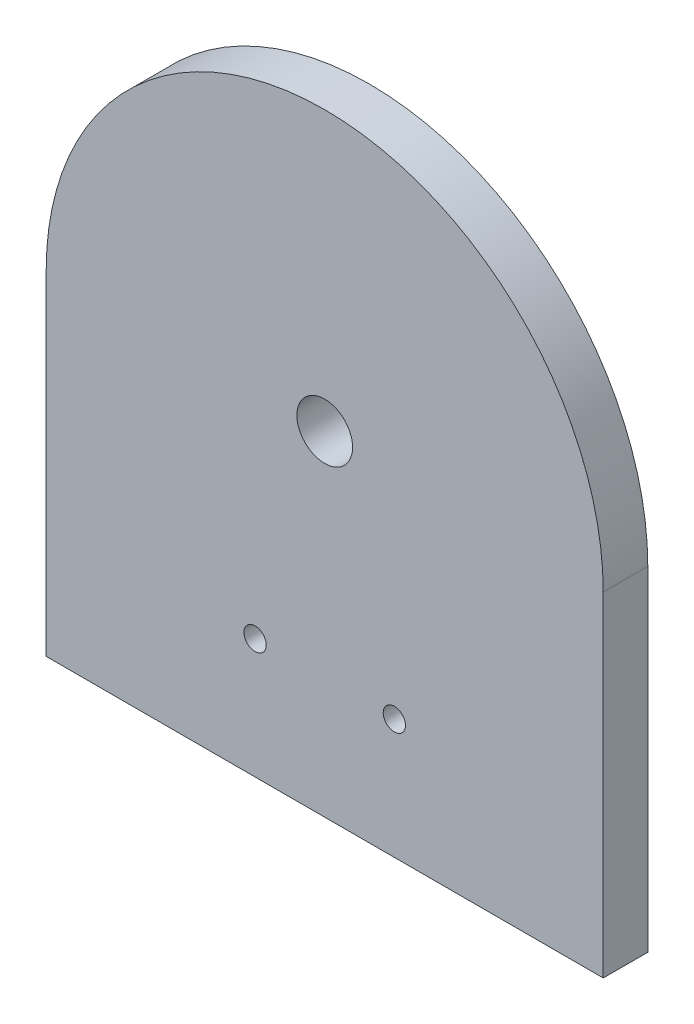
ISO-10303-21;
HEADER;
FILE_DESCRIPTION(('STEP AP214'),'2;1');
FILE_NAME('part.step','',(''),(''),'','','');
FILE_SCHEMA(('AUTOMOTIVE_DESIGN { 1 0 10303 214 1 1 1 1 }'));
ENDSEC;
DATA;
#1=APPLICATION_CONTEXT('core data for automotive mechanical design processes');
#2=APPLICATION_PROTOCOL_DEFINITION('international standard','automotive_design',2000,#1);
#3=PRODUCT_CONTEXT('',#1,'mechanical');
#4=PRODUCT('Part','Part','',(#3));
#5=PRODUCT_RELATED_PRODUCT_CATEGORY('part','',(#4));
#6=PRODUCT_DEFINITION_FORMATION('','',#4);
#7=PRODUCT_DEFINITION_CONTEXT('part definition',#1,'design');
#8=PRODUCT_DEFINITION('design','',#6,#7);
#9=PRODUCT_DEFINITION_SHAPE('','',#8);
#10=(LENGTH_UNIT() NAMED_UNIT(*) SI_UNIT(.MILLI.,.METRE.));
#11=(NAMED_UNIT(*) PLANE_ANGLE_UNIT() SI_UNIT($,.RADIAN.));
#12=(NAMED_UNIT(*) SI_UNIT($,.STERADIAN.) SOLID_ANGLE_UNIT());
#13=UNCERTAINTY_MEASURE_WITH_UNIT(LENGTH_MEASURE(1.E-05),#10,'distance_accuracy_value','');
#14=(GEOMETRIC_REPRESENTATION_CONTEXT(3) GLOBAL_UNCERTAINTY_ASSIGNED_CONTEXT((#13)) GLOBAL_UNIT_ASSIGNED_CONTEXT((#10,
#11,#12)) REPRESENTATION_CONTEXT('',''));
#15=CARTESIAN_POINT('',(0.,0.,0.));
#16=DIRECTION('',(0.,0.,1.));
#17=DIRECTION('',(1.,0.,0.));
#18=AXIS2_PLACEMENT_3D('',#15,#16,#17);
#19=CARTESIAN_POINT('',(0.,0.,4.));
#20=DIRECTION('',(0.,0.,-1.));
#21=DIRECTION('',(-1.,0.,0.));
#22=AXIS2_PLACEMENT_3D('',#19,#20,#21);
#23=PLANE('',#22);
#24=CARTESIAN_POINT('',(-12.5000000000001,-38.5000000000017,4.));
#25=DIRECTION('',(0.,0.,-1.));
#26=DIRECTION('',(-1.,0.,0.));
#27=AXIS2_PLACEMENT_3D('',#24,#25,#26);
#28=CIRCLE('',#27,2.);
#29=CARTESIAN_POINT('',(-14.5000000000001,-38.5000000000017,4.));
#30=VERTEX_POINT('',#29);
#31=EDGE_CURVE('E126',#30,#30,#28,.T.);
#32=ORIENTED_EDGE('',*,*,#31,.T.);
#33=EDGE_LOOP('',(#32));
#34=FACE_BOUND('',#33,.T.);
#35=CARTESIAN_POINT('',(12.4999999999999,-38.5000000000017,4.));
#36=DIRECTION('',(0.,0.,-1.));
#37=DIRECTION('',(-1.,0.,0.));
#38=AXIS2_PLACEMENT_3D('',#35,#36,#37);
#39=CIRCLE('',#38,2.);
#40=CARTESIAN_POINT('',(10.4999999999999,-38.5000000000017,4.));
#41=VERTEX_POINT('',#40);
#42=EDGE_CURVE('E118',#41,#41,#39,.T.);
#43=ORIENTED_EDGE('',*,*,#42,.T.);
#44=EDGE_LOOP('',(#43));
#45=FACE_BOUND('',#44,.T.);
#46=CARTESIAN_POINT('',(0.,0.,4.));
#47=DIRECTION('',(0.,0.,1.));
#48=DIRECTION('',(-1.,0.,0.));
#49=AXIS2_PLACEMENT_3D('',#46,#47,#48);
#50=CIRCLE('',#49,50.);
#51=CARTESIAN_POINT('',(50.,0.,4.));
#52=VERTEX_POINT('',#51);
#53=CARTESIAN_POINT('',(-50.,0.,4.));
#54=VERTEX_POINT('',#53);
#55=EDGE_CURVE('E88',#52,#54,#50,.T.);
#56=ORIENTED_EDGE('',*,*,#55,.T.);
#57=DIRECTION('',(0.,-1.,0.));
#58=VECTOR('',#57,1.);
#59=CARTESIAN_POINT('',(-50.,0.,4.));
#60=LINE('',#59,#58);
#61=CARTESIAN_POINT('',(-50.,-60.,4.));
#62=VERTEX_POINT('',#61);
#63=EDGE_CURVE('E83',#54,#62,#60,.T.);
#64=ORIENTED_EDGE('',*,*,#63,.T.);
#65=DIRECTION('',(1.,0.,0.));
#66=VECTOR('',#65,1.);
#67=CARTESIAN_POINT('',(-50.,-60.,4.));
#68=LINE('',#67,#66);
#69=CARTESIAN_POINT('',(50.,-60.,4.));
#70=VERTEX_POINT('',#69);
#71=EDGE_CURVE('E86',#62,#70,#68,.T.);
#72=ORIENTED_EDGE('',*,*,#71,.T.);
#73=DIRECTION('',(0.,1.,0.));
#74=VECTOR('',#73,1.);
#75=CARTESIAN_POINT('',(50.,-60.,4.));
#76=LINE('',#75,#74);
#77=EDGE_CURVE('E53',#70,#52,#76,.T.);
#78=ORIENTED_EDGE('',*,*,#77,.T.);
#79=EDGE_LOOP('',(#56,#64,#72,#78));
#80=FACE_BOUND('',#79,.T.);
#81=CARTESIAN_POINT('',(0.,0.,4.));
#82=DIRECTION('',(0.,0.,1.));
#83=DIRECTION('',(1.,0.,0.));
#84=AXIS2_PLACEMENT_3D('',#81,#82,#83);
#85=CIRCLE('',#84,5.);
#86=CARTESIAN_POINT('',(5.,0.,4.));
#87=VERTEX_POINT('',#86);
#88=EDGE_CURVE('E103',#87,#87,#85,.T.);
#89=ORIENTED_EDGE('',*,*,#88,.F.);
#90=EDGE_LOOP('',(#89));
#91=FACE_BOUND('',#90,.T.);
#92=ADVANCED_FACE('F36',(#34,#45,#80,#91),#23,.F.);
#93=CARTESIAN_POINT('',(0.,0.,-4.));
#94=DIRECTION('',(0.,0.,-1.));
#95=DIRECTION('',(-1.,0.,0.));
#96=AXIS2_PLACEMENT_3D('',#93,#94,#95);
#97=PLANE('',#96);
#98=CARTESIAN_POINT('',(-12.5000000000001,-38.5000000000017,-3.99999999998836));
#99=DIRECTION('',(0.,0.,1.));
#100=DIRECTION('',(1.,0.,0.));
#101=AXIS2_PLACEMENT_3D('',#98,#99,#100);
#102=CIRCLE('',#101,2.);
#103=CARTESIAN_POINT('',(-10.5000000000001,-38.5000000000017,-3.99999999998836));
#104=VERTEX_POINT('',#103);
#105=EDGE_CURVE('E129',#104,#104,#102,.T.);
#106=ORIENTED_EDGE('',*,*,#105,.T.);
#107=EDGE_LOOP('',(#106));
#108=FACE_BOUND('',#107,.T.);
#109=CARTESIAN_POINT('',(12.4999999999999,-38.5000000000017,-3.99999999998836));
#110=DIRECTION('',(0.,0.,1.));
#111=DIRECTION('',(1.,0.,0.));
#112=AXIS2_PLACEMENT_3D('',#109,#110,#111);
#113=CIRCLE('',#112,2.);
#114=CARTESIAN_POINT('',(14.4999999999999,-38.5000000000017,-3.99999999998836));
#115=VERTEX_POINT('',#114);
#116=EDGE_CURVE('E123',#115,#115,#113,.T.);
#117=ORIENTED_EDGE('',*,*,#116,.T.);
#118=EDGE_LOOP('',(#117));
#119=FACE_BOUND('',#118,.T.);
#120=CARTESIAN_POINT('',(0.,0.,-4.));
#121=DIRECTION('',(0.,0.,1.));
#122=DIRECTION('',(-1.,0.,0.));
#123=AXIS2_PLACEMENT_3D('',#120,#121,#122);
#124=CIRCLE('',#123,50.);
#125=CARTESIAN_POINT('',(50.,0.,-4.));
#126=VERTEX_POINT('',#125);
#127=CARTESIAN_POINT('',(-50.,0.,-4.));
#128=VERTEX_POINT('',#127);
#129=EDGE_CURVE('E100',#126,#128,#124,.T.);
#130=ORIENTED_EDGE('',*,*,#129,.F.);
#131=DIRECTION('',(0.,1.,0.));
#132=VECTOR('',#131,1.);
#133=CARTESIAN_POINT('',(50.,-60.,-4.));
#134=LINE('',#133,#132);
#135=CARTESIAN_POINT('',(50.,-60.,-4.));
#136=VERTEX_POINT('',#135);
#137=EDGE_CURVE('E76',#136,#126,#134,.T.);
#138=ORIENTED_EDGE('',*,*,#137,.F.);
#139=DIRECTION('',(1.,0.,0.));
#140=VECTOR('',#139,1.);
#141=CARTESIAN_POINT('',(-50.,-60.,-4.));
#142=LINE('',#141,#140);
#143=CARTESIAN_POINT('',(-50.,-60.,-4.));
#144=VERTEX_POINT('',#143);
#145=EDGE_CURVE('E70',#144,#136,#142,.T.);
#146=ORIENTED_EDGE('',*,*,#145,.F.);
#147=DIRECTION('',(0.,-1.,0.));
#148=VECTOR('',#147,1.);
#149=CARTESIAN_POINT('',(-50.,0.,-4.));
#150=LINE('',#149,#148);
#151=EDGE_CURVE('E92',#128,#144,#150,.T.);
#152=ORIENTED_EDGE('',*,*,#151,.F.);
#153=EDGE_LOOP('',(#130,#138,#146,#152));
#154=FACE_BOUND('',#153,.T.);
#155=CARTESIAN_POINT('',(0.,0.,-4.));
#156=DIRECTION('',(0.,0.,1.));
#157=DIRECTION('',(1.,0.,0.));
#158=AXIS2_PLACEMENT_3D('',#155,#156,#157);
#159=CIRCLE('',#158,5.);
#160=CARTESIAN_POINT('',(5.,0.,-4.));
#161=VERTEX_POINT('',#160);
#162=EDGE_CURVE('E115',#161,#161,#159,.T.);
#163=ORIENTED_EDGE('',*,*,#162,.T.);
#164=EDGE_LOOP('',(#163));
#165=FACE_BOUND('',#164,.T.);
#166=ADVANCED_FACE('F111',(#108,#119,#154,#165),#97,.T.);
#167=CARTESIAN_POINT('',(0.,0.,4.));
#168=DIRECTION('',(0.,0.,-1.));
#169=DIRECTION('',(-1.,0.,0.));
#170=AXIS2_PLACEMENT_3D('',#167,#168,#169);
#171=CYLINDRICAL_SURFACE('',#170,50.);
#172=ORIENTED_EDGE('',*,*,#129,.T.);
#173=DIRECTION('',(0.,0.,-1.));
#174=VECTOR('',#173,1.);
#175=CARTESIAN_POINT('',(-50.,0.,4.));
#176=LINE('',#175,#174);
#177=EDGE_CURVE('E11',#54,#128,#176,.T.);
#178=ORIENTED_EDGE('',*,*,#177,.F.);
#179=ORIENTED_EDGE('',*,*,#55,.F.);
#180=DIRECTION('',(0.,0.,-1.));
#181=VECTOR('',#180,1.);
#182=CARTESIAN_POINT('',(50.,0.,4.));
#183=LINE('',#182,#181);
#184=EDGE_CURVE('E96',#52,#126,#183,.T.);
#185=ORIENTED_EDGE('',*,*,#184,.T.);
#186=EDGE_LOOP('',(#172,#178,#179,#185));
#187=FACE_BOUND('',#186,.T.);
#188=ADVANCED_FACE('F38',(#187),#171,.T.);
#189=CARTESIAN_POINT('',(-50.,0.,4.));
#190=DIRECTION('',(1.,0.,0.));
#191=DIRECTION('',(0.,1.,0.));
#192=AXIS2_PLACEMENT_3D('',#189,#190,#191);
#193=PLANE('',#192);
#194=ORIENTED_EDGE('',*,*,#151,.T.);
#195=DIRECTION('',(0.,0.,-1.));
#196=VECTOR('',#195,1.);
#197=CARTESIAN_POINT('',(-50.,-60.,4.));
#198=LINE('',#197,#196);
#199=EDGE_CURVE('E45',#62,#144,#198,.T.);
#200=ORIENTED_EDGE('',*,*,#199,.F.);
#201=ORIENTED_EDGE('',*,*,#63,.F.);
#202=ORIENTED_EDGE('',*,*,#177,.T.);
#203=EDGE_LOOP('',(#194,#200,#201,#202));
#204=FACE_BOUND('',#203,.T.);
#205=ADVANCED_FACE('F91',(#204),#193,.F.);
#206=CARTESIAN_POINT('',(-50.,-60.,4.));
#207=DIRECTION('',(0.,1.,0.));
#208=DIRECTION('',(-1.,0.,0.));
#209=AXIS2_PLACEMENT_3D('',#206,#207,#208);
#210=PLANE('',#209);
#211=ORIENTED_EDGE('',*,*,#145,.T.);
#212=DIRECTION('',(0.,0.,-1.));
#213=VECTOR('',#212,1.);
#214=CARTESIAN_POINT('',(50.,-60.,4.));
#215=LINE('',#214,#213);
#216=EDGE_CURVE('E93',#70,#136,#215,.T.);
#217=ORIENTED_EDGE('',*,*,#216,.F.);
#218=ORIENTED_EDGE('',*,*,#71,.F.);
#219=ORIENTED_EDGE('',*,*,#199,.T.);
#220=EDGE_LOOP('',(#211,#217,#218,#219));
#221=FACE_BOUND('',#220,.T.);
#222=ADVANCED_FACE('F94',(#221),#210,.F.);
#223=CARTESIAN_POINT('',(50.,-60.,4.));
#224=DIRECTION('',(-1.,0.,0.));
#225=DIRECTION('',(0.,0.,1.));
#226=AXIS2_PLACEMENT_3D('',#223,#224,#225);
#227=PLANE('',#226);
#228=ORIENTED_EDGE('',*,*,#137,.T.);
#229=ORIENTED_EDGE('',*,*,#184,.F.);
#230=ORIENTED_EDGE('',*,*,#77,.F.);
#231=ORIENTED_EDGE('',*,*,#216,.T.);
#232=EDGE_LOOP('',(#228,#229,#230,#231));
#233=FACE_BOUND('',#232,.T.);
#234=ADVANCED_FACE('F108',(#233),#227,.F.);
#235=CARTESIAN_POINT('',(0.,0.,4.));
#236=DIRECTION('',(0.,0.,-1.));
#237=DIRECTION('',(-1.,0.,0.));
#238=AXIS2_PLACEMENT_3D('',#235,#236,#237);
#239=CYLINDRICAL_SURFACE('',#238,5.);
#240=ORIENTED_EDGE('',*,*,#88,.T.);
#241=EDGE_LOOP('',(#240));
#242=FACE_BOUND('',#241,.T.);
#243=ORIENTED_EDGE('',*,*,#162,.F.);
#244=EDGE_LOOP('',(#243));
#245=FACE_BOUND('',#244,.T.);
#246=ADVANCED_FACE('F148',(#242,#245),#239,.F.);
#247=CARTESIAN_POINT('',(12.4999999999999,-38.5000000000017,-3.99999999998836));
#248=DIRECTION('',(0.,0.,1.));
#249=DIRECTION('',(1.,0.,0.));
#250=AXIS2_PLACEMENT_3D('',#247,#248,#249);
#251=CYLINDRICAL_SURFACE('',#250,2.);
#252=ORIENTED_EDGE('',*,*,#116,.F.);
#253=EDGE_LOOP('',(#252));
#254=FACE_BOUND('',#253,.T.);
#255=ORIENTED_EDGE('',*,*,#42,.F.);
#256=EDGE_LOOP('',(#255));
#257=FACE_BOUND('',#256,.T.);
#258=ADVANCED_FACE('F138',(#254,#257),#251,.F.);
#259=CARTESIAN_POINT('',(-12.5000000000001,-38.5000000000017,-3.99999999998836));
#260=DIRECTION('',(0.,0.,1.));
#261=DIRECTION('',(1.,0.,0.));
#262=AXIS2_PLACEMENT_3D('',#259,#260,#261);
#263=CYLINDRICAL_SURFACE('',#262,2.);
#264=ORIENTED_EDGE('',*,*,#105,.F.);
#265=EDGE_LOOP('',(#264));
#266=FACE_BOUND('',#265,.T.);
#267=ORIENTED_EDGE('',*,*,#31,.F.);
#268=EDGE_LOOP('',(#267));
#269=FACE_BOUND('',#268,.T.);
#270=ADVANCED_FACE('F135',(#266,#269),#263,.F.);
#271=CLOSED_SHELL('',(#92,#166,#188,#205,#222,#234,#246,#258,#270));
#272=MANIFOLD_SOLID_BREP('B2',#271);
#273=ADVANCED_BREP_SHAPE_REPRESENTATION('',(#18,#272),#14);
#274=SHAPE_DEFINITION_REPRESENTATION(#9,#273);
ENDSEC;
END-ISO-10303-21;
